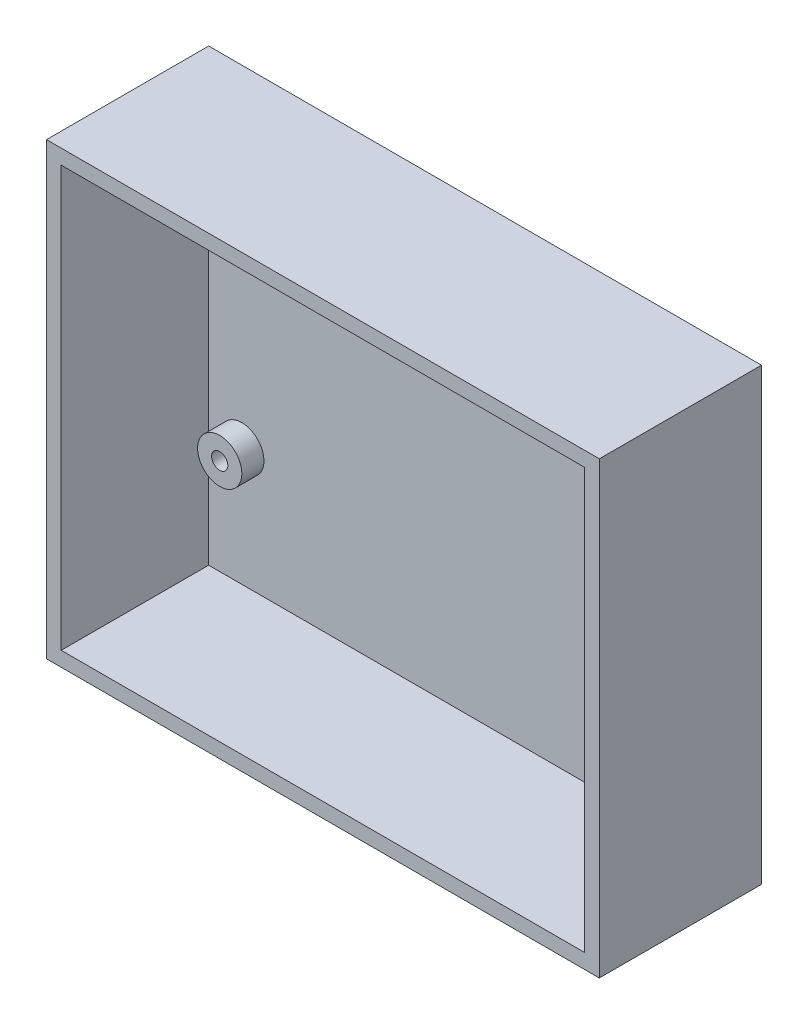
ISO-10303-21;
HEADER;
FILE_DESCRIPTION(('STEP AP214'),'2;1');
FILE_NAME('part.step','',(''),(''),'','','');
FILE_SCHEMA(('AUTOMOTIVE_DESIGN { 1 0 10303 214 1 1 1 1 }'));
ENDSEC;
DATA;
#1=APPLICATION_CONTEXT('core data for automotive mechanical design processes');
#2=APPLICATION_PROTOCOL_DEFINITION('international standard','automotive_design',2000,#1);
#3=PRODUCT_CONTEXT('',#1,'mechanical');
#4=PRODUCT('Part','Part','',(#3));
#5=PRODUCT_RELATED_PRODUCT_CATEGORY('part','',(#4));
#6=PRODUCT_DEFINITION_FORMATION('','',#4);
#7=PRODUCT_DEFINITION_CONTEXT('part definition',#1,'design');
#8=PRODUCT_DEFINITION('design','',#6,#7);
#9=PRODUCT_DEFINITION_SHAPE('','',#8);
#10=(LENGTH_UNIT() NAMED_UNIT(*) SI_UNIT(.MILLI.,.METRE.));
#11=(NAMED_UNIT(*) PLANE_ANGLE_UNIT() SI_UNIT($,.RADIAN.));
#12=(NAMED_UNIT(*) SI_UNIT($,.STERADIAN.) SOLID_ANGLE_UNIT());
#13=UNCERTAINTY_MEASURE_WITH_UNIT(LENGTH_MEASURE(1.E-05),#10,'distance_accuracy_value','');
#14=(GEOMETRIC_REPRESENTATION_CONTEXT(3) GLOBAL_UNCERTAINTY_ASSIGNED_CONTEXT((#13)) GLOBAL_UNIT_ASSIGNED_CONTEXT((#10,
#11,#12)) REPRESENTATION_CONTEXT('',''));
#15=CARTESIAN_POINT('',(0.,0.,0.));
#16=DIRECTION('',(0.,0.,1.));
#17=DIRECTION('',(1.,0.,0.));
#18=AXIS2_PLACEMENT_3D('',#15,#16,#17);
#19=CARTESIAN_POINT('',(2.,2.,22.));
#20=DIRECTION('',(1.,0.,0.));
#21=DIRECTION('',(0.,0.,-1.));
#22=AXIS2_PLACEMENT_3D('',#19,#20,#21);
#23=PLANE('',#22);
#24=DIRECTION('',(0.,0.,-1.));
#25=VECTOR('',#24,1.);
#26=CARTESIAN_POINT('',(2.,2.,22.));
#27=LINE('',#26,#25);
#28=CARTESIAN_POINT('',(2.,2.,22.));
#29=VERTEX_POINT('',#28);
#30=CARTESIAN_POINT('',(2.,2.,2.));
#31=VERTEX_POINT('',#30);
#32=EDGE_CURVE('E118',#29,#31,#27,.T.);
#33=ORIENTED_EDGE('',*,*,#32,.T.);
#34=DIRECTION('',(0.,1.,0.));
#35=VECTOR('',#34,1.);
#36=CARTESIAN_POINT('',(2.,2.,2.));
#37=LINE('',#36,#35);
#38=CARTESIAN_POINT('',(2.,59.,2.));
#39=VERTEX_POINT('',#38);
#40=EDGE_CURVE('E106',#31,#39,#37,.T.);
#41=ORIENTED_EDGE('',*,*,#40,.T.);
#42=DIRECTION('',(0.,0.,-1.));
#43=VECTOR('',#42,1.);
#44=CARTESIAN_POINT('',(2.,59.,22.));
#45=LINE('',#44,#43);
#46=CARTESIAN_POINT('',(2.,59.,22.));
#47=VERTEX_POINT('',#46);
#48=EDGE_CURVE('E115',#47,#39,#45,.T.);
#49=ORIENTED_EDGE('',*,*,#48,.F.);
#50=DIRECTION('',(0.,-1.,0.));
#51=VECTOR('',#50,1.);
#52=CARTESIAN_POINT('',(2.,2.,22.));
#53=LINE('',#52,#51);
#54=EDGE_CURVE('E119',#47,#29,#53,.T.);
#55=ORIENTED_EDGE('',*,*,#54,.T.);
#56=EDGE_LOOP('',(#33,#41,#49,#55));
#57=FACE_BOUND('',#56,.T.);
#58=ADVANCED_FACE('F39',(#57),#23,.T.);
#59=CARTESIAN_POINT('',(2.,2.,22.));
#60=DIRECTION('',(0.,1.,0.));
#61=DIRECTION('',(0.,0.,1.));
#62=AXIS2_PLACEMENT_3D('',#59,#60,#61);
#63=PLANE('',#62);
#64=DIRECTION('',(0.,0.,-1.));
#65=VECTOR('',#64,1.);
#66=CARTESIAN_POINT('',(73.,2.,22.));
#67=LINE('',#66,#65);
#68=CARTESIAN_POINT('',(73.,2.,22.));
#69=VERTEX_POINT('',#68);
#70=CARTESIAN_POINT('',(73.,2.,2.));
#71=VERTEX_POINT('',#70);
#72=EDGE_CURVE('E126',#69,#71,#67,.T.);
#73=ORIENTED_EDGE('',*,*,#72,.T.);
#74=DIRECTION('',(-1.,0.,0.));
#75=VECTOR('',#74,1.);
#76=CARTESIAN_POINT('',(2.,2.,2.));
#77=LINE('',#76,#75);
#78=EDGE_CURVE('E120',#71,#31,#77,.T.);
#79=ORIENTED_EDGE('',*,*,#78,.T.);
#80=ORIENTED_EDGE('',*,*,#32,.F.);
#81=DIRECTION('',(1.,0.,0.));
#82=VECTOR('',#81,1.);
#83=CARTESIAN_POINT('',(2.,2.,22.));
#84=LINE('',#83,#82);
#85=EDGE_CURVE('E203',#29,#69,#84,.T.);
#86=ORIENTED_EDGE('',*,*,#85,.T.);
#87=EDGE_LOOP('',(#73,#79,#80,#86));
#88=FACE_BOUND('',#87,.T.);
#89=ADVANCED_FACE('F212',(#88),#63,.T.);
#90=CARTESIAN_POINT('',(73.,2.,22.));
#91=DIRECTION('',(-1.,0.,0.));
#92=DIRECTION('',(0.,0.,1.));
#93=AXIS2_PLACEMENT_3D('',#90,#91,#92);
#94=PLANE('',#93);
#95=DIRECTION('',(0.,0.,-1.));
#96=VECTOR('',#95,1.);
#97=CARTESIAN_POINT('',(73.,59.,22.));
#98=LINE('',#97,#96);
#99=CARTESIAN_POINT('',(73.,59.,22.));
#100=VERTEX_POINT('',#99);
#101=CARTESIAN_POINT('',(73.,59.,2.));
#102=VERTEX_POINT('',#101);
#103=EDGE_CURVE('E63',#100,#102,#98,.T.);
#104=ORIENTED_EDGE('',*,*,#103,.T.);
#105=DIRECTION('',(0.,-1.,0.));
#106=VECTOR('',#105,1.);
#107=CARTESIAN_POINT('',(73.,2.,2.));
#108=LINE('',#107,#106);
#109=EDGE_CURVE('E56',#102,#71,#108,.T.);
#110=ORIENTED_EDGE('',*,*,#109,.T.);
#111=ORIENTED_EDGE('',*,*,#72,.F.);
#112=DIRECTION('',(0.,1.,0.));
#113=VECTOR('',#112,1.);
#114=CARTESIAN_POINT('',(73.,2.,22.));
#115=LINE('',#114,#113);
#116=EDGE_CURVE('E128',#69,#100,#115,.T.);
#117=ORIENTED_EDGE('',*,*,#116,.T.);
#118=EDGE_LOOP('',(#104,#110,#111,#117));
#119=FACE_BOUND('',#118,.T.);
#120=ADVANCED_FACE('F207',(#119),#94,.T.);
#121=CARTESIAN_POINT('',(2.,59.,22.));
#122=DIRECTION('',(0.,-1.,0.));
#123=DIRECTION('',(0.,0.,-1.));
#124=AXIS2_PLACEMENT_3D('',#121,#122,#123);
#125=PLANE('',#124);
#126=ORIENTED_EDGE('',*,*,#48,.T.);
#127=DIRECTION('',(1.,0.,0.));
#128=VECTOR('',#127,1.);
#129=CARTESIAN_POINT('',(2.,59.,2.));
#130=LINE('',#129,#128);
#131=EDGE_CURVE('E103',#39,#102,#130,.T.);
#132=ORIENTED_EDGE('',*,*,#131,.T.);
#133=ORIENTED_EDGE('',*,*,#103,.F.);
#134=DIRECTION('',(-1.,0.,0.));
#135=VECTOR('',#134,1.);
#136=CARTESIAN_POINT('',(2.,59.,22.));
#137=LINE('',#136,#135);
#138=EDGE_CURVE('E124',#100,#47,#137,.T.);
#139=ORIENTED_EDGE('',*,*,#138,.T.);
#140=EDGE_LOOP('',(#126,#132,#133,#139));
#141=FACE_BOUND('',#140,.T.);
#142=ADVANCED_FACE('F122',(#141),#125,.T.);
#143=CARTESIAN_POINT('',(0.,0.,22.));
#144=DIRECTION('',(0.,0.,-1.));
#145=DIRECTION('',(-1.,0.,0.));
#146=AXIS2_PLACEMENT_3D('',#143,#144,#145);
#147=PLANE('',#146);
#148=DIRECTION('',(0.,-1.,0.));
#149=VECTOR('',#148,1.);
#150=CARTESIAN_POINT('',(0.,0.,22.));
#151=LINE('',#150,#149);
#152=CARTESIAN_POINT('',(0.,61.,22.));
#153=VERTEX_POINT('',#152);
#154=CARTESIAN_POINT('',(0.,0.,22.));
#155=VERTEX_POINT('',#154);
#156=EDGE_CURVE('E136',#153,#155,#151,.T.);
#157=ORIENTED_EDGE('',*,*,#156,.T.);
#158=DIRECTION('',(1.,0.,0.));
#159=VECTOR('',#158,1.);
#160=CARTESIAN_POINT('',(0.,0.,22.));
#161=LINE('',#160,#159);
#162=CARTESIAN_POINT('',(75.,0.,22.));
#163=VERTEX_POINT('',#162);
#164=EDGE_CURVE('E139',#155,#163,#161,.T.);
#165=ORIENTED_EDGE('',*,*,#164,.T.);
#166=DIRECTION('',(0.,1.,0.));
#167=VECTOR('',#166,1.);
#168=CARTESIAN_POINT('',(75.,0.,22.));
#169=LINE('',#168,#167);
#170=CARTESIAN_POINT('',(75.,61.,22.));
#171=VERTEX_POINT('',#170);
#172=EDGE_CURVE('E142',#163,#171,#169,.T.);
#173=ORIENTED_EDGE('',*,*,#172,.T.);
#174=DIRECTION('',(-1.,0.,0.));
#175=VECTOR('',#174,1.);
#176=CARTESIAN_POINT('',(0.,61.,22.));
#177=LINE('',#176,#175);
#178=EDGE_CURVE('E144',#171,#153,#177,.T.);
#179=ORIENTED_EDGE('',*,*,#178,.T.);
#180=EDGE_LOOP('',(#157,#165,#173,#179));
#181=FACE_BOUND('',#180,.T.);
#182=ORIENTED_EDGE('',*,*,#54,.F.);
#183=ORIENTED_EDGE('',*,*,#138,.F.);
#184=ORIENTED_EDGE('',*,*,#116,.F.);
#185=ORIENTED_EDGE('',*,*,#85,.F.);
#186=EDGE_LOOP('',(#182,#183,#184,#185));
#187=FACE_BOUND('',#186,.T.);
#188=ADVANCED_FACE('F210',(#181,#187),#147,.F.);
#189=CARTESIAN_POINT('',(0.,0.,0.));
#190=DIRECTION('',(0.,0.,-1.));
#191=DIRECTION('',(-1.,0.,0.));
#192=AXIS2_PLACEMENT_3D('',#189,#190,#191);
#193=PLANE('',#192);
#194=CARTESIAN_POINT('',(68.5,18.,0.));
#195=DIRECTION('',(0.,0.,1.));
#196=DIRECTION('',(1.,0.,0.));
#197=AXIS2_PLACEMENT_3D('',#194,#195,#196);
#198=CIRCLE('',#197,1.10000000000001);
#199=CARTESIAN_POINT('',(69.6,18.,0.));
#200=VERTEX_POINT('',#199);
#201=EDGE_CURVE('E493',#200,#200,#198,.T.);
#202=ORIENTED_EDGE('',*,*,#201,.T.);
#203=EDGE_LOOP('',(#202));
#204=FACE_BOUND('',#203,.T.);
#205=CARTESIAN_POINT('',(6.5,54.,0.));
#206=DIRECTION('',(0.,0.,1.));
#207=DIRECTION('',(1.,0.,0.));
#208=AXIS2_PLACEMENT_3D('',#205,#206,#207);
#209=CIRCLE('',#208,1.1);
#210=CARTESIAN_POINT('',(7.6,54.,0.));
#211=VERTEX_POINT('',#210);
#212=EDGE_CURVE('E495',#211,#211,#209,.T.);
#213=ORIENTED_EDGE('',*,*,#212,.T.);
#214=EDGE_LOOP('',(#213));
#215=FACE_BOUND('',#214,.T.);
#216=CARTESIAN_POINT('',(68.5,54.,0.));
#217=DIRECTION('',(0.,0.,1.));
#218=DIRECTION('',(1.,0.,0.));
#219=AXIS2_PLACEMENT_3D('',#216,#217,#218);
#220=CIRCLE('',#219,1.10000000000001);
#221=CARTESIAN_POINT('',(69.6,54.,0.));
#222=VERTEX_POINT('',#221);
#223=EDGE_CURVE('E499',#222,#222,#220,.T.);
#224=ORIENTED_EDGE('',*,*,#223,.T.);
#225=EDGE_LOOP('',(#224));
#226=FACE_BOUND('',#225,.T.);
#227=CARTESIAN_POINT('',(6.5,18.,0.));
#228=DIRECTION('',(0.,0.,1.));
#229=DIRECTION('',(1.,0.,0.));
#230=AXIS2_PLACEMENT_3D('',#227,#228,#229);
#231=CIRCLE('',#230,1.1);
#232=CARTESIAN_POINT('',(7.6,18.,0.));
#233=VERTEX_POINT('',#232);
#234=EDGE_CURVE('E174',#233,#233,#231,.T.);
#235=ORIENTED_EDGE('',*,*,#234,.T.);
#236=EDGE_LOOP('',(#235));
#237=FACE_BOUND('',#236,.T.);
#238=DIRECTION('',(0.,-1.,0.));
#239=VECTOR('',#238,1.);
#240=CARTESIAN_POINT('',(0.,0.,0.));
#241=LINE('',#240,#239);
#242=CARTESIAN_POINT('',(0.,61.,0.));
#243=VERTEX_POINT('',#242);
#244=CARTESIAN_POINT('',(0.,0.,0.));
#245=VERTEX_POINT('',#244);
#246=EDGE_CURVE('E135',#243,#245,#241,.T.);
#247=ORIENTED_EDGE('',*,*,#246,.F.);
#248=DIRECTION('',(-1.,0.,0.));
#249=VECTOR('',#248,1.);
#250=CARTESIAN_POINT('',(0.,61.,0.));
#251=LINE('',#250,#249);
#252=CARTESIAN_POINT('',(75.,61.,0.));
#253=VERTEX_POINT('',#252);
#254=EDGE_CURVE('E140',#253,#243,#251,.T.);
#255=ORIENTED_EDGE('',*,*,#254,.F.);
#256=DIRECTION('',(0.,1.,0.));
#257=VECTOR('',#256,1.);
#258=CARTESIAN_POINT('',(75.,0.,0.));
#259=LINE('',#258,#257);
#260=CARTESIAN_POINT('',(75.,0.,0.));
#261=VERTEX_POINT('',#260);
#262=EDGE_CURVE('E152',#261,#253,#259,.T.);
#263=ORIENTED_EDGE('',*,*,#262,.F.);
#264=DIRECTION('',(1.,0.,0.));
#265=VECTOR('',#264,1.);
#266=CARTESIAN_POINT('',(0.,0.,0.));
#267=LINE('',#266,#265);
#268=EDGE_CURVE('E149',#245,#261,#267,.T.);
#269=ORIENTED_EDGE('',*,*,#268,.F.);
#270=EDGE_LOOP('',(#247,#255,#263,#269));
#271=FACE_BOUND('',#270,.T.);
#272=ADVANCED_FACE('F225',(#204,#215,#226,#237,#271),#193,.T.);
#273=CARTESIAN_POINT('',(0.,0.,22.));
#274=DIRECTION('',(1.,0.,0.));
#275=DIRECTION('',(0.,0.,-1.));
#276=AXIS2_PLACEMENT_3D('',#273,#274,#275);
#277=PLANE('',#276);
#278=ORIENTED_EDGE('',*,*,#246,.T.);
#279=DIRECTION('',(0.,0.,-1.));
#280=VECTOR('',#279,1.);
#281=CARTESIAN_POINT('',(0.,0.,22.));
#282=LINE('',#281,#280);
#283=EDGE_CURVE('E110',#155,#245,#282,.T.);
#284=ORIENTED_EDGE('',*,*,#283,.F.);
#285=ORIENTED_EDGE('',*,*,#156,.F.);
#286=DIRECTION('',(0.,0.,-1.));
#287=VECTOR('',#286,1.);
#288=CARTESIAN_POINT('',(0.,61.,22.));
#289=LINE('',#288,#287);
#290=EDGE_CURVE('E146',#153,#243,#289,.T.);
#291=ORIENTED_EDGE('',*,*,#290,.T.);
#292=EDGE_LOOP('',(#278,#284,#285,#291));
#293=FACE_BOUND('',#292,.T.);
#294=ADVANCED_FACE('F41',(#293),#277,.F.);
#295=CARTESIAN_POINT('',(0.,0.,22.));
#296=DIRECTION('',(0.,1.,0.));
#297=DIRECTION('',(0.,0.,1.));
#298=AXIS2_PLACEMENT_3D('',#295,#296,#297);
#299=PLANE('',#298);
#300=ORIENTED_EDGE('',*,*,#268,.T.);
#301=DIRECTION('',(0.,0.,-1.));
#302=VECTOR('',#301,1.);
#303=CARTESIAN_POINT('',(75.,0.,22.));
#304=LINE('',#303,#302);
#305=EDGE_CURVE('E160',#163,#261,#304,.T.);
#306=ORIENTED_EDGE('',*,*,#305,.F.);
#307=ORIENTED_EDGE('',*,*,#164,.F.);
#308=ORIENTED_EDGE('',*,*,#283,.T.);
#309=EDGE_LOOP('',(#300,#306,#307,#308));
#310=FACE_BOUND('',#309,.T.);
#311=ADVANCED_FACE('F236',(#310),#299,.F.);
#312=CARTESIAN_POINT('',(75.,0.,22.));
#313=DIRECTION('',(-1.,0.,0.));
#314=DIRECTION('',(0.,0.,1.));
#315=AXIS2_PLACEMENT_3D('',#312,#313,#314);
#316=PLANE('',#315);
#317=ORIENTED_EDGE('',*,*,#262,.T.);
#318=DIRECTION('',(0.,0.,-1.));
#319=VECTOR('',#318,1.);
#320=CARTESIAN_POINT('',(75.,61.,22.));
#321=LINE('',#320,#319);
#322=EDGE_CURVE('E158',#171,#253,#321,.T.);
#323=ORIENTED_EDGE('',*,*,#322,.F.);
#324=ORIENTED_EDGE('',*,*,#172,.F.);
#325=ORIENTED_EDGE('',*,*,#305,.T.);
#326=EDGE_LOOP('',(#317,#323,#324,#325));
#327=FACE_BOUND('',#326,.T.);
#328=ADVANCED_FACE('F233',(#327),#316,.F.);
#329=CARTESIAN_POINT('',(0.,61.,22.));
#330=DIRECTION('',(0.,-1.,0.));
#331=DIRECTION('',(0.,0.,-1.));
#332=AXIS2_PLACEMENT_3D('',#329,#330,#331);
#333=PLANE('',#332);
#334=ORIENTED_EDGE('',*,*,#254,.T.);
#335=ORIENTED_EDGE('',*,*,#290,.F.);
#336=ORIENTED_EDGE('',*,*,#178,.F.);
#337=ORIENTED_EDGE('',*,*,#322,.T.);
#338=EDGE_LOOP('',(#334,#335,#336,#337));
#339=FACE_BOUND('',#338,.T.);
#340=ADVANCED_FACE('F230',(#339),#333,.F.);
#341=CARTESIAN_POINT('',(0.,0.,2.));
#342=DIRECTION('',(0.,0.,-1.));
#343=DIRECTION('',(-1.,0.,0.));
#344=AXIS2_PLACEMENT_3D('',#341,#342,#343);
#345=PLANE('',#344);
#346=CARTESIAN_POINT('',(68.5,54.,2.));
#347=DIRECTION('',(0.,0.,-1.));
#348=DIRECTION('',(-1.,0.,0.));
#349=AXIS2_PLACEMENT_3D('',#346,#347,#348);
#350=CIRCLE('',#349,3.00000000000001);
#351=CARTESIAN_POINT('',(65.5,54.,2.));
#352=VERTEX_POINT('',#351);
#353=EDGE_CURVE('E11',#352,#352,#350,.F.);
#354=ORIENTED_EDGE('',*,*,#353,.F.);
#355=EDGE_LOOP('',(#354));
#356=FACE_BOUND('',#355,.T.);
#357=CARTESIAN_POINT('',(6.5,54.,2.));
#358=DIRECTION('',(0.,0.,-1.));
#359=DIRECTION('',(-1.,0.,0.));
#360=AXIS2_PLACEMENT_3D('',#357,#358,#359);
#361=CIRCLE('',#360,3.);
#362=CARTESIAN_POINT('',(3.5,54.,2.));
#363=VERTEX_POINT('',#362);
#364=EDGE_CURVE('E48',#363,#363,#361,.F.);
#365=ORIENTED_EDGE('',*,*,#364,.F.);
#366=EDGE_LOOP('',(#365));
#367=FACE_BOUND('',#366,.T.);
#368=CARTESIAN_POINT('',(68.5,18.,2.));
#369=DIRECTION('',(0.,0.,-1.));
#370=DIRECTION('',(-1.,0.,0.));
#371=AXIS2_PLACEMENT_3D('',#368,#369,#370);
#372=CIRCLE('',#371,3.00000000000001);
#373=CARTESIAN_POINT('',(65.5,18.,2.));
#374=VERTEX_POINT('',#373);
#375=EDGE_CURVE('E165',#374,#374,#372,.F.);
#376=ORIENTED_EDGE('',*,*,#375,.F.);
#377=EDGE_LOOP('',(#376));
#378=FACE_BOUND('',#377,.T.);
#379=CARTESIAN_POINT('',(6.5,18.,2.));
#380=DIRECTION('',(0.,0.,-1.));
#381=DIRECTION('',(-1.,0.,0.));
#382=AXIS2_PLACEMENT_3D('',#379,#380,#381);
#383=CIRCLE('',#382,3.);
#384=CARTESIAN_POINT('',(3.5,18.,2.));
#385=VERTEX_POINT('',#384);
#386=EDGE_CURVE('E109',#385,#385,#383,.F.);
#387=ORIENTED_EDGE('',*,*,#386,.F.);
#388=EDGE_LOOP('',(#387));
#389=FACE_BOUND('',#388,.T.);
#390=ORIENTED_EDGE('',*,*,#40,.F.);
#391=ORIENTED_EDGE('',*,*,#78,.F.);
#392=ORIENTED_EDGE('',*,*,#109,.F.);
#393=ORIENTED_EDGE('',*,*,#131,.F.);
#394=EDGE_LOOP('',(#390,#391,#392,#393));
#395=FACE_BOUND('',#394,.T.);
#396=ADVANCED_FACE('F105',(#356,#367,#378,#389,#395),#345,.F.);
#397=CARTESIAN_POINT('',(6.5,18.,5.));
#398=DIRECTION('',(0.,0.,-1.));
#399=DIRECTION('',(-1.,0.,0.));
#400=AXIS2_PLACEMENT_3D('',#397,#398,#399);
#401=CYLINDRICAL_SURFACE('',#400,3.);
#402=CARTESIAN_POINT('',(6.5,18.,5.));
#403=DIRECTION('',(0.,0.,1.));
#404=DIRECTION('',(1.,0.,0.));
#405=AXIS2_PLACEMENT_3D('',#402,#403,#404);
#406=CIRCLE('',#405,3.);
#407=CARTESIAN_POINT('',(9.5,18.,5.));
#408=VERTEX_POINT('',#407);
#409=EDGE_CURVE('E197',#408,#408,#406,.T.);
#410=ORIENTED_EDGE('',*,*,#409,.F.);
#411=EDGE_LOOP('',(#410));
#412=FACE_BOUND('',#411,.T.);
#413=ORIENTED_EDGE('',*,*,#386,.T.);
#414=EDGE_LOOP('',(#413));
#415=FACE_BOUND('',#414,.T.);
#416=ADVANCED_FACE('F298',(#412,#415),#401,.T.);
#417=CARTESIAN_POINT('',(6.5,18.,5.));
#418=DIRECTION('',(0.,0.,1.));
#419=DIRECTION('',(1.,0.,0.));
#420=AXIS2_PLACEMENT_3D('',#417,#418,#419);
#421=PLANE('',#420);
#422=CARTESIAN_POINT('',(6.5,18.,5.));
#423=DIRECTION('',(0.,0.,1.));
#424=DIRECTION('',(1.,0.,0.));
#425=AXIS2_PLACEMENT_3D('',#422,#423,#424);
#426=CIRCLE('',#425,1.1);
#427=CARTESIAN_POINT('',(7.6,18.,5.));
#428=VERTEX_POINT('',#427);
#429=EDGE_CURVE('E43',#428,#428,#426,.F.);
#430=ORIENTED_EDGE('',*,*,#429,.T.);
#431=EDGE_LOOP('',(#430));
#432=FACE_BOUND('',#431,.T.);
#433=ORIENTED_EDGE('',*,*,#409,.T.);
#434=EDGE_LOOP('',(#433));
#435=FACE_BOUND('',#434,.T.);
#436=ADVANCED_FACE('F308',(#432,#435),#421,.T.);
#437=CARTESIAN_POINT('',(68.5,18.,5.));
#438=DIRECTION('',(0.,0.,-1.));
#439=DIRECTION('',(-1.,0.,0.));
#440=AXIS2_PLACEMENT_3D('',#437,#438,#439);
#441=CYLINDRICAL_SURFACE('',#440,3.00000000000001);
#442=CARTESIAN_POINT('',(68.5,18.,5.));
#443=DIRECTION('',(0.,0.,1.));
#444=DIRECTION('',(1.,0.,0.));
#445=AXIS2_PLACEMENT_3D('',#442,#443,#444);
#446=CIRCLE('',#445,3.00000000000001);
#447=CARTESIAN_POINT('',(71.5,18.,5.));
#448=VERTEX_POINT('',#447);
#449=EDGE_CURVE('E190',#448,#448,#446,.T.);
#450=ORIENTED_EDGE('',*,*,#449,.F.);
#451=EDGE_LOOP('',(#450));
#452=FACE_BOUND('',#451,.T.);
#453=ORIENTED_EDGE('',*,*,#375,.T.);
#454=EDGE_LOOP('',(#453));
#455=FACE_BOUND('',#454,.T.);
#456=ADVANCED_FACE('F318',(#452,#455),#441,.T.);
#457=CARTESIAN_POINT('',(68.5,18.,5.));
#458=DIRECTION('',(0.,0.,1.));
#459=DIRECTION('',(1.,0.,0.));
#460=AXIS2_PLACEMENT_3D('',#457,#458,#459);
#461=PLANE('',#460);
#462=CARTESIAN_POINT('',(68.5,18.,5.));
#463=DIRECTION('',(0.,0.,1.));
#464=DIRECTION('',(1.,0.,0.));
#465=AXIS2_PLACEMENT_3D('',#462,#463,#464);
#466=CIRCLE('',#465,1.10000000000001);
#467=CARTESIAN_POINT('',(69.6,18.,5.));
#468=VERTEX_POINT('',#467);
#469=EDGE_CURVE('E176',#468,#468,#466,.F.);
#470=ORIENTED_EDGE('',*,*,#469,.T.);
#471=EDGE_LOOP('',(#470));
#472=FACE_BOUND('',#471,.T.);
#473=ORIENTED_EDGE('',*,*,#449,.T.);
#474=EDGE_LOOP('',(#473));
#475=FACE_BOUND('',#474,.T.);
#476=ADVANCED_FACE('F326',(#472,#475),#461,.T.);
#477=CARTESIAN_POINT('',(6.5,54.,5.));
#478=DIRECTION('',(0.,0.,-1.));
#479=DIRECTION('',(-1.,0.,0.));
#480=AXIS2_PLACEMENT_3D('',#477,#478,#479);
#481=CYLINDRICAL_SURFACE('',#480,3.);
#482=CARTESIAN_POINT('',(6.5,54.,5.));
#483=DIRECTION('',(0.,0.,1.));
#484=DIRECTION('',(1.,0.,0.));
#485=AXIS2_PLACEMENT_3D('',#482,#483,#484);
#486=CIRCLE('',#485,3.);
#487=CARTESIAN_POINT('',(9.5,54.,5.));
#488=VERTEX_POINT('',#487);
#489=EDGE_CURVE('E185',#488,#488,#486,.T.);
#490=ORIENTED_EDGE('',*,*,#489,.F.);
#491=EDGE_LOOP('',(#490));
#492=FACE_BOUND('',#491,.T.);
#493=ORIENTED_EDGE('',*,*,#364,.T.);
#494=EDGE_LOOP('',(#493));
#495=FACE_BOUND('',#494,.T.);
#496=ADVANCED_FACE('F336',(#492,#495),#481,.T.);
#497=CARTESIAN_POINT('',(6.5,54.,5.));
#498=DIRECTION('',(0.,0.,1.));
#499=DIRECTION('',(1.,0.,0.));
#500=AXIS2_PLACEMENT_3D('',#497,#498,#499);
#501=PLANE('',#500);
#502=CARTESIAN_POINT('',(6.5,54.,5.));
#503=DIRECTION('',(0.,0.,1.));
#504=DIRECTION('',(1.,0.,0.));
#505=AXIS2_PLACEMENT_3D('',#502,#503,#504);
#506=CIRCLE('',#505,1.1);
#507=CARTESIAN_POINT('',(7.6,54.,5.));
#508=VERTEX_POINT('',#507);
#509=EDGE_CURVE('E173',#508,#508,#506,.F.);
#510=ORIENTED_EDGE('',*,*,#509,.T.);
#511=EDGE_LOOP('',(#510));
#512=FACE_BOUND('',#511,.T.);
#513=ORIENTED_EDGE('',*,*,#489,.T.);
#514=EDGE_LOOP('',(#513));
#515=FACE_BOUND('',#514,.T.);
#516=ADVANCED_FACE('F345',(#512,#515),#501,.T.);
#517=CARTESIAN_POINT('',(68.5,54.,5.));
#518=DIRECTION('',(0.,0.,-1.));
#519=DIRECTION('',(-1.,0.,0.));
#520=AXIS2_PLACEMENT_3D('',#517,#518,#519);
#521=CYLINDRICAL_SURFACE('',#520,3.00000000000001);
#522=CARTESIAN_POINT('',(68.5,54.,5.));
#523=DIRECTION('',(0.,0.,1.));
#524=DIRECTION('',(1.,0.,0.));
#525=AXIS2_PLACEMENT_3D('',#522,#523,#524);
#526=CIRCLE('',#525,3.00000000000001);
#527=CARTESIAN_POINT('',(71.5,54.,5.));
#528=VERTEX_POINT('',#527);
#529=EDGE_CURVE('E181',#528,#528,#526,.T.);
#530=ORIENTED_EDGE('',*,*,#529,.F.);
#531=EDGE_LOOP('',(#530));
#532=FACE_BOUND('',#531,.T.);
#533=ORIENTED_EDGE('',*,*,#353,.T.);
#534=EDGE_LOOP('',(#533));
#535=FACE_BOUND('',#534,.T.);
#536=ADVANCED_FACE('F355',(#532,#535),#521,.T.);
#537=CARTESIAN_POINT('',(68.5,54.,5.));
#538=DIRECTION('',(0.,0.,1.));
#539=DIRECTION('',(1.,0.,0.));
#540=AXIS2_PLACEMENT_3D('',#537,#538,#539);
#541=PLANE('',#540);
#542=CARTESIAN_POINT('',(68.5,54.,5.));
#543=DIRECTION('',(0.,0.,1.));
#544=DIRECTION('',(1.,0.,0.));
#545=AXIS2_PLACEMENT_3D('',#542,#543,#544);
#546=CIRCLE('',#545,1.10000000000001);
#547=CARTESIAN_POINT('',(69.6,54.,5.));
#548=VERTEX_POINT('',#547);
#549=EDGE_CURVE('E170',#548,#548,#546,.F.);
#550=ORIENTED_EDGE('',*,*,#549,.T.);
#551=EDGE_LOOP('',(#550));
#552=FACE_BOUND('',#551,.T.);
#553=ORIENTED_EDGE('',*,*,#529,.T.);
#554=EDGE_LOOP('',(#553));
#555=FACE_BOUND('',#554,.T.);
#556=ADVANCED_FACE('F365',(#552,#555),#541,.T.);
#557=CARTESIAN_POINT('',(68.5,54.,22.));
#558=DIRECTION('',(0.,0.,-1.));
#559=DIRECTION('',(-1.,0.,0.));
#560=AXIS2_PLACEMENT_3D('',#557,#558,#559);
#561=CYLINDRICAL_SURFACE('',#560,1.10000000000001);
#562=ORIENTED_EDGE('',*,*,#549,.F.);
#563=EDGE_LOOP('',(#562));
#564=FACE_BOUND('',#563,.T.);
#565=ORIENTED_EDGE('',*,*,#223,.F.);
#566=EDGE_LOOP('',(#565));
#567=FACE_BOUND('',#566,.T.);
#568=ADVANCED_FACE('F374',(#564,#567),#561,.F.);
#569=CARTESIAN_POINT('',(6.5,54.,22.));
#570=DIRECTION('',(0.,0.,-1.));
#571=DIRECTION('',(-1.,0.,0.));
#572=AXIS2_PLACEMENT_3D('',#569,#570,#571);
#573=CYLINDRICAL_SURFACE('',#572,1.1);
#574=ORIENTED_EDGE('',*,*,#509,.F.);
#575=EDGE_LOOP('',(#574));
#576=FACE_BOUND('',#575,.T.);
#577=ORIENTED_EDGE('',*,*,#212,.F.);
#578=EDGE_LOOP('',(#577));
#579=FACE_BOUND('',#578,.T.);
#580=ADVANCED_FACE('F384',(#576,#579),#573,.F.);
#581=CARTESIAN_POINT('',(68.5,18.,22.));
#582=DIRECTION('',(0.,0.,-1.));
#583=DIRECTION('',(-1.,0.,0.));
#584=AXIS2_PLACEMENT_3D('',#581,#582,#583);
#585=CYLINDRICAL_SURFACE('',#584,1.10000000000001);
#586=ORIENTED_EDGE('',*,*,#469,.F.);
#587=EDGE_LOOP('',(#586));
#588=FACE_BOUND('',#587,.T.);
#589=ORIENTED_EDGE('',*,*,#201,.F.);
#590=EDGE_LOOP('',(#589));
#591=FACE_BOUND('',#590,.T.);
#592=ADVANCED_FACE('F394',(#588,#591),#585,.F.);
#593=CARTESIAN_POINT('',(6.5,18.,22.));
#594=DIRECTION('',(0.,0.,-1.));
#595=DIRECTION('',(-1.,0.,0.));
#596=AXIS2_PLACEMENT_3D('',#593,#594,#595);
#597=CYLINDRICAL_SURFACE('',#596,1.1);
#598=ORIENTED_EDGE('',*,*,#429,.F.);
#599=EDGE_LOOP('',(#598));
#600=FACE_BOUND('',#599,.T.);
#601=ORIENTED_EDGE('',*,*,#234,.F.);
#602=EDGE_LOOP('',(#601));
#603=FACE_BOUND('',#602,.T.);
#604=ADVANCED_FACE('F404',(#600,#603),#597,.F.);
#605=CLOSED_SHELL('',(#58,#89,#120,#142,#188,#272,#294,#311,#328,#340,#396,#416,#436,#456,#476,
#496,#516,#536,#556,#568,#580,#592,#604));
#606=MANIFOLD_SOLID_BREP('B2',#605);
#607=ADVANCED_BREP_SHAPE_REPRESENTATION('',(#18,#606),#14);
#608=SHAPE_DEFINITION_REPRESENTATION(#9,#607);
ENDSEC;
END-ISO-10303-21;
